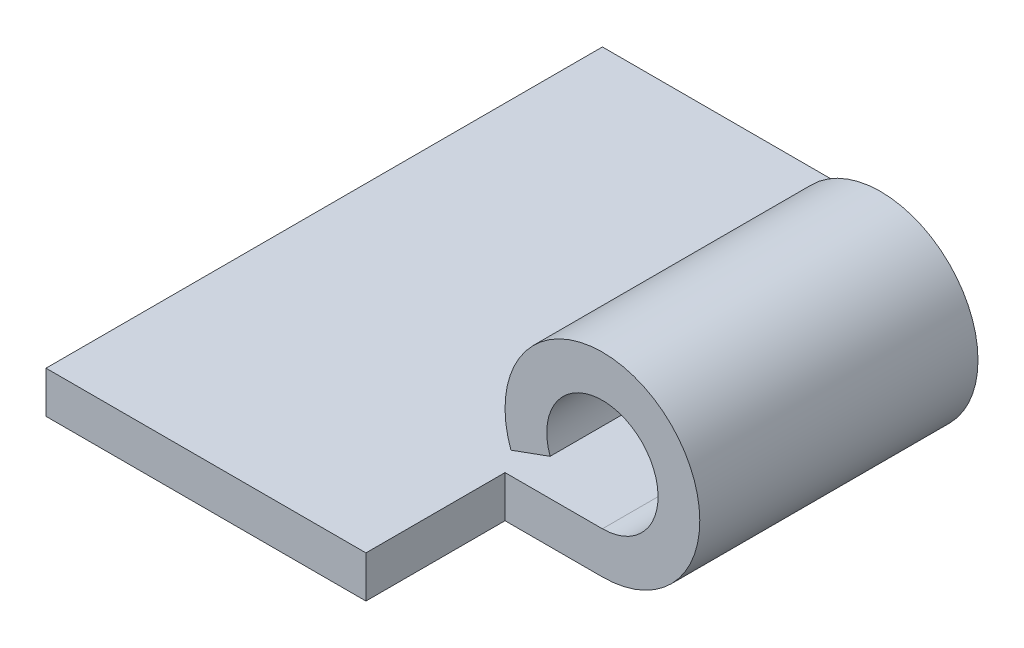
ISO-10303-21;
HEADER;
FILE_DESCRIPTION(('STEP AP214'),'2;1');
FILE_NAME('part.step','',(''),(''),'','','');
FILE_SCHEMA(('AUTOMOTIVE_DESIGN { 1 0 10303 214 1 1 1 1 }'));
ENDSEC;
DATA;
#1=APPLICATION_CONTEXT('core data for automotive mechanical design processes');
#2=APPLICATION_PROTOCOL_DEFINITION('international standard','automotive_design',2000,#1);
#3=PRODUCT_CONTEXT('',#1,'mechanical');
#4=PRODUCT('Part','Part','',(#3));
#5=PRODUCT_RELATED_PRODUCT_CATEGORY('part','',(#4));
#6=PRODUCT_DEFINITION_FORMATION('','',#4);
#7=PRODUCT_DEFINITION_CONTEXT('part definition',#1,'design');
#8=PRODUCT_DEFINITION('design','',#6,#7);
#9=PRODUCT_DEFINITION_SHAPE('','',#8);
#10=(LENGTH_UNIT() NAMED_UNIT(*) SI_UNIT(.MILLI.,.METRE.));
#11=(NAMED_UNIT(*) PLANE_ANGLE_UNIT() SI_UNIT($,.RADIAN.));
#12=(NAMED_UNIT(*) SI_UNIT($,.STERADIAN.) SOLID_ANGLE_UNIT());
#13=UNCERTAINTY_MEASURE_WITH_UNIT(LENGTH_MEASURE(1.E-05),#10,'distance_accuracy_value','');
#14=(GEOMETRIC_REPRESENTATION_CONTEXT(3) GLOBAL_UNCERTAINTY_ASSIGNED_CONTEXT((#13)) GLOBAL_UNIT_ASSIGNED_CONTEXT((#10,
#11,#12)) REPRESENTATION_CONTEXT('',''));
#15=CARTESIAN_POINT('',(0.,0.,0.));
#16=DIRECTION('',(0.,0.,1.));
#17=DIRECTION('',(1.,0.,0.));
#18=AXIS2_PLACEMENT_3D('',#15,#16,#17);
#19=CARTESIAN_POINT('',(18.5,-1.5,-5.));
#20=DIRECTION('',(0.,0.,1.));
#21=DIRECTION('',(1.,0.,0.));
#22=AXIS2_PLACEMENT_3D('',#19,#20,#21);
#23=PLANE('',#22);
#24=DIRECTION('',(1.,0.,0.));
#25=VECTOR('',#24,1.);
#26=CARTESIAN_POINT('',(0.,0.,-5.));
#27=LINE('',#26,#25);
#28=CARTESIAN_POINT('',(11.5,0.,-5.));
#29=VERTEX_POINT('',#28);
#30=CARTESIAN_POINT('',(15.,0.,-5.));
#31=VERTEX_POINT('',#30);
#32=EDGE_CURVE('E208',#29,#31,#27,.T.);
#33=ORIENTED_EDGE('',*,*,#32,.T.);
#34=DIRECTION('',(0.,-1.,0.));
#35=VECTOR('',#34,1.);
#36=CARTESIAN_POINT('',(15.,0.,-5.));
#37=LINE('',#36,#35);
#38=CARTESIAN_POINT('',(15.,-1.5,-5.));
#39=VERTEX_POINT('',#38);
#40=EDGE_CURVE('E12',#31,#39,#37,.T.);
#41=ORIENTED_EDGE('',*,*,#40,.T.);
#42=DIRECTION('',(1.,0.,0.));
#43=VECTOR('',#42,1.);
#44=CARTESIAN_POINT('',(18.5,-1.5,-5.));
#45=LINE('',#44,#43);
#46=CARTESIAN_POINT('',(11.5,-1.5,-5.));
#47=VERTEX_POINT('',#46);
#48=EDGE_CURVE('E163',#47,#39,#45,.T.);
#49=ORIENTED_EDGE('',*,*,#48,.F.);
#50=DIRECTION('',(0.,1.,0.));
#51=VECTOR('',#50,1.);
#52=CARTESIAN_POINT('',(11.5,-1.5,-5.));
#53=LINE('',#52,#51);
#54=EDGE_CURVE('E152',#47,#29,#53,.T.);
#55=ORIENTED_EDGE('',*,*,#54,.T.);
#56=EDGE_LOOP('',(#33,#41,#49,#55));
#57=FACE_BOUND('',#56,.T.);
#58=ADVANCED_FACE('F54',(#57),#23,.F.);
#59=CARTESIAN_POINT('',(15.,2.,10.));
#60=DIRECTION('',(0.,0.,-1.));
#61=DIRECTION('',(-1.,0.,0.));
#62=AXIS2_PLACEMENT_3D('',#59,#60,#61);
#63=CYLINDRICAL_SURFACE('',#62,3.5);
#64=DIRECTION('',(0.,0.,-1.));
#65=VECTOR('',#64,1.);
#66=CARTESIAN_POINT('',(15.,-1.5,10.));
#67=LINE('',#66,#65);
#68=CARTESIAN_POINT('',(15.,-1.5,5.));
#69=VERTEX_POINT('',#68);
#70=EDGE_CURVE('E232',#69,#39,#67,.T.);
#71=ORIENTED_EDGE('',*,*,#70,.T.);
#72=CARTESIAN_POINT('',(15.,2.,-5.));
#73=DIRECTION('',(0.,0.,1.));
#74=DIRECTION('',(1.,0.,0.));
#75=AXIS2_PLACEMENT_3D('',#72,#73,#74);
#76=CIRCLE('',#75,3.5);
#77=CARTESIAN_POINT('',(11.7110758272493,0.802929498360173,-5.));
#78=VERTEX_POINT('',#77);
#79=EDGE_CURVE('E216',#39,#78,#76,.T.);
#80=ORIENTED_EDGE('',*,*,#79,.T.);
#81=DIRECTION('',(0.,0.,-1.));
#82=VECTOR('',#81,1.);
#83=CARTESIAN_POINT('',(11.7110758272493,0.802929498360173,10.));
#84=LINE('',#83,#82);
#85=CARTESIAN_POINT('',(11.7110758272493,0.802929498360173,5.));
#86=VERTEX_POINT('',#85);
#87=EDGE_CURVE('E62',#86,#78,#84,.T.);
#88=ORIENTED_EDGE('',*,*,#87,.F.);
#89=CARTESIAN_POINT('',(15.,2.,5.));
#90=DIRECTION('',(0.,0.,-1.));
#91=DIRECTION('',(-1.,0.,0.));
#92=AXIS2_PLACEMENT_3D('',#89,#90,#91);
#93=CIRCLE('',#92,3.5);
#94=EDGE_CURVE('E204',#86,#69,#93,.T.);
#95=ORIENTED_EDGE('',*,*,#94,.T.);
#96=EDGE_LOOP('',(#71,#80,#88,#95));
#97=FACE_BOUND('',#96,.T.);
#98=ADVANCED_FACE('F56',(#97),#63,.T.);
#99=CARTESIAN_POINT('',(13.1206147584282,1.31595971334867,10.));
#100=DIRECTION('',(0.342020143325665,-0.93969262078591,0.));
#101=DIRECTION('',(0.93969262078591,0.342020143325665,0.));
#102=AXIS2_PLACEMENT_3D('',#99,#100,#101);
#103=PLANE('',#102);
#104=DIRECTION('',(-0.93969262078591,-0.342020143325665,0.));
#105=VECTOR('',#104,1.);
#106=CARTESIAN_POINT('',(13.1206147584282,1.31595971334867,-5.));
#107=LINE('',#106,#105);
#108=CARTESIAN_POINT('',(13.1206147584282,1.31595971334867,-5.));
#109=VERTEX_POINT('',#108);
#110=EDGE_CURVE('E214',#109,#78,#107,.T.);
#111=ORIENTED_EDGE('',*,*,#110,.F.);
#112=DIRECTION('',(0.,0.,-1.));
#113=VECTOR('',#112,1.);
#114=CARTESIAN_POINT('',(13.1206147584282,1.31595971334867,10.));
#115=LINE('',#114,#113);
#116=CARTESIAN_POINT('',(13.1206147584282,1.31595971334867,5.));
#117=VERTEX_POINT('',#116);
#118=EDGE_CURVE('E252',#117,#109,#115,.T.);
#119=ORIENTED_EDGE('',*,*,#118,.F.);
#120=DIRECTION('',(0.93969262078591,0.342020143325665,0.));
#121=VECTOR('',#120,1.);
#122=CARTESIAN_POINT('',(13.1206147584282,1.31595971334867,5.));
#123=LINE('',#122,#121);
#124=EDGE_CURVE('E202',#86,#117,#123,.T.);
#125=ORIENTED_EDGE('',*,*,#124,.F.);
#126=ORIENTED_EDGE('',*,*,#87,.T.);
#127=EDGE_LOOP('',(#111,#119,#125,#126));
#128=FACE_BOUND('',#127,.T.);
#129=ADVANCED_FACE('F262',(#128),#103,.T.);
#130=CARTESIAN_POINT('',(15.,2.,10.));
#131=DIRECTION('',(0.,0.,-1.));
#132=DIRECTION('',(-1.,0.,0.));
#133=AXIS2_PLACEMENT_3D('',#130,#131,#132);
#134=CYLINDRICAL_SURFACE('',#133,2.);
#135=CARTESIAN_POINT('',(15.,2.,-5.));
#136=DIRECTION('',(0.,0.,1.));
#137=DIRECTION('',(1.,0.,0.));
#138=AXIS2_PLACEMENT_3D('',#135,#136,#137);
#139=CIRCLE('',#138,2.);
#140=EDGE_CURVE('E211',#31,#109,#139,.T.);
#141=ORIENTED_EDGE('',*,*,#140,.F.);
#142=DIRECTION('',(0.,0.,-1.));
#143=VECTOR('',#142,1.);
#144=CARTESIAN_POINT('',(15.,0.,10.));
#145=LINE('',#144,#143);
#146=CARTESIAN_POINT('',(15.,0.,5.));
#147=VERTEX_POINT('',#146);
#148=EDGE_CURVE('E248',#147,#31,#145,.T.);
#149=ORIENTED_EDGE('',*,*,#148,.F.);
#150=CARTESIAN_POINT('',(15.,2.,5.));
#151=DIRECTION('',(0.,0.,-1.));
#152=DIRECTION('',(-1.,0.,0.));
#153=AXIS2_PLACEMENT_3D('',#150,#151,#152);
#154=CIRCLE('',#153,2.);
#155=EDGE_CURVE('E199',#117,#147,#154,.T.);
#156=ORIENTED_EDGE('',*,*,#155,.F.);
#157=ORIENTED_EDGE('',*,*,#118,.T.);
#158=EDGE_LOOP('',(#141,#149,#156,#157));
#159=FACE_BOUND('',#158,.T.);
#160=ADVANCED_FACE('F270',(#159),#134,.F.);
#161=CARTESIAN_POINT('',(0.,0.,10.));
#162=DIRECTION('',(0.,1.,0.));
#163=DIRECTION('',(0.,0.,1.));
#164=AXIS2_PLACEMENT_3D('',#161,#162,#163);
#165=PLANE('',#164);
#166=ORIENTED_EDGE('',*,*,#32,.F.);
#167=DIRECTION('',(0.,0.,1.));
#168=VECTOR('',#167,1.);
#169=CARTESIAN_POINT('',(11.5,0.,10.));
#170=LINE('',#169,#168);
#171=CARTESIAN_POINT('',(11.5,0.,-10.));
#172=VERTEX_POINT('',#171);
#173=EDGE_CURVE('E156',#172,#29,#170,.T.);
#174=ORIENTED_EDGE('',*,*,#173,.F.);
#175=DIRECTION('',(1.,0.,0.));
#176=VECTOR('',#175,1.);
#177=CARTESIAN_POINT('',(0.,0.,-10.));
#178=LINE('',#177,#176);
#179=CARTESIAN_POINT('',(0.,0.,-10.));
#180=VERTEX_POINT('',#179);
#181=EDGE_CURVE('E220',#180,#172,#178,.T.);
#182=ORIENTED_EDGE('',*,*,#181,.F.);
#183=DIRECTION('',(0.,0.,-1.));
#184=VECTOR('',#183,1.);
#185=CARTESIAN_POINT('',(0.,0.,10.));
#186=LINE('',#185,#184);
#187=CARTESIAN_POINT('',(0.,0.,10.));
#188=VERTEX_POINT('',#187);
#189=EDGE_CURVE('E245',#188,#180,#186,.T.);
#190=ORIENTED_EDGE('',*,*,#189,.F.);
#191=DIRECTION('',(1.,0.,0.));
#192=VECTOR('',#191,1.);
#193=CARTESIAN_POINT('',(0.,0.,10.));
#194=LINE('',#193,#192);
#195=CARTESIAN_POINT('',(11.5,0.,10.));
#196=VERTEX_POINT('',#195);
#197=EDGE_CURVE('E221',#188,#196,#194,.T.);
#198=ORIENTED_EDGE('',*,*,#197,.T.);
#199=DIRECTION('',(0.,0.,1.));
#200=VECTOR('',#199,1.);
#201=CARTESIAN_POINT('',(11.5,0.,10.));
#202=LINE('',#201,#200);
#203=CARTESIAN_POINT('',(11.5,0.,5.));
#204=VERTEX_POINT('',#203);
#205=EDGE_CURVE('E73',#204,#196,#202,.T.);
#206=ORIENTED_EDGE('',*,*,#205,.F.);
#207=DIRECTION('',(-1.,0.,0.));
#208=VECTOR('',#207,1.);
#209=CARTESIAN_POINT('',(0.,0.,5.));
#210=LINE('',#209,#208);
#211=EDGE_CURVE('E196',#147,#204,#210,.T.);
#212=ORIENTED_EDGE('',*,*,#211,.F.);
#213=ORIENTED_EDGE('',*,*,#148,.T.);
#214=EDGE_LOOP('',(#166,#174,#182,#190,#198,#206,#212,#213));
#215=FACE_BOUND('',#214,.T.);
#216=ADVANCED_FACE('F274',(#215),#165,.T.);
#217=CARTESIAN_POINT('',(0.,-1.5,10.));
#218=DIRECTION('',(-1.,0.,0.));
#219=DIRECTION('',(0.,0.,1.));
#220=AXIS2_PLACEMENT_3D('',#217,#218,#219);
#221=PLANE('',#220);
#222=DIRECTION('',(0.,1.,0.));
#223=VECTOR('',#222,1.);
#224=CARTESIAN_POINT('',(0.,-1.5,-10.));
#225=LINE('',#224,#223);
#226=CARTESIAN_POINT('',(0.,-1.5,-10.));
#227=VERTEX_POINT('',#226);
#228=EDGE_CURVE('E235',#227,#180,#225,.T.);
#229=ORIENTED_EDGE('',*,*,#228,.F.);
#230=DIRECTION('',(0.,0.,-1.));
#231=VECTOR('',#230,1.);
#232=CARTESIAN_POINT('',(0.,-1.5,10.));
#233=LINE('',#232,#231);
#234=CARTESIAN_POINT('',(0.,-1.5,10.));
#235=VERTEX_POINT('',#234);
#236=EDGE_CURVE('E242',#235,#227,#233,.T.);
#237=ORIENTED_EDGE('',*,*,#236,.F.);
#238=DIRECTION('',(0.,1.,0.));
#239=VECTOR('',#238,1.);
#240=CARTESIAN_POINT('',(0.,-1.5,10.));
#241=LINE('',#240,#239);
#242=EDGE_CURVE('E225',#235,#188,#241,.T.);
#243=ORIENTED_EDGE('',*,*,#242,.T.);
#244=ORIENTED_EDGE('',*,*,#189,.T.);
#245=EDGE_LOOP('',(#229,#237,#243,#244));
#246=FACE_BOUND('',#245,.T.);
#247=ADVANCED_FACE('F286',(#246),#221,.T.);
#248=CARTESIAN_POINT('',(0.,-1.5,10.));
#249=DIRECTION('',(0.,1.,0.));
#250=DIRECTION('',(0.,0.,1.));
#251=AXIS2_PLACEMENT_3D('',#248,#249,#250);
#252=PLANE('',#251);
#253=DIRECTION('',(0.,0.,1.));
#254=VECTOR('',#253,1.);
#255=CARTESIAN_POINT('',(11.5,-1.5,-10.));
#256=LINE('',#255,#254);
#257=CARTESIAN_POINT('',(11.5,-1.5,-10.));
#258=VERTEX_POINT('',#257);
#259=EDGE_CURVE('E83',#258,#47,#256,.T.);
#260=ORIENTED_EDGE('',*,*,#259,.T.);
#261=ORIENTED_EDGE('',*,*,#48,.T.);
#262=ORIENTED_EDGE('',*,*,#70,.F.);
#263=DIRECTION('',(-1.,0.,0.));
#264=VECTOR('',#263,1.);
#265=CARTESIAN_POINT('',(18.5,-1.5,5.));
#266=LINE('',#265,#264);
#267=CARTESIAN_POINT('',(11.5,-1.5,5.));
#268=VERTEX_POINT('',#267);
#269=EDGE_CURVE('E175',#69,#268,#266,.T.);
#270=ORIENTED_EDGE('',*,*,#269,.T.);
#271=DIRECTION('',(0.,0.,1.));
#272=VECTOR('',#271,1.);
#273=CARTESIAN_POINT('',(11.5,-1.5,10.));
#274=LINE('',#273,#272);
#275=CARTESIAN_POINT('',(11.5,-1.5,10.));
#276=VERTEX_POINT('',#275);
#277=EDGE_CURVE('E182',#268,#276,#274,.T.);
#278=ORIENTED_EDGE('',*,*,#277,.T.);
#279=DIRECTION('',(1.,0.,0.));
#280=VECTOR('',#279,1.);
#281=CARTESIAN_POINT('',(0.,-1.5,10.));
#282=LINE('',#281,#280);
#283=EDGE_CURVE('E228',#235,#276,#282,.T.);
#284=ORIENTED_EDGE('',*,*,#283,.F.);
#285=ORIENTED_EDGE('',*,*,#236,.T.);
#286=DIRECTION('',(1.,0.,0.));
#287=VECTOR('',#286,1.);
#288=CARTESIAN_POINT('',(0.,-1.5,-10.));
#289=LINE('',#288,#287);
#290=EDGE_CURVE('E173',#227,#258,#289,.T.);
#291=ORIENTED_EDGE('',*,*,#290,.T.);
#292=EDGE_LOOP('',(#260,#261,#262,#270,#278,#284,#285,#291));
#293=FACE_BOUND('',#292,.T.);
#294=ADVANCED_FACE('F171',(#293),#252,.F.);
#295=CARTESIAN_POINT('',(15.,2.,10.));
#296=DIRECTION('',(0.,0.,1.));
#297=DIRECTION('',(1.,0.,0.));
#298=AXIS2_PLACEMENT_3D('',#295,#296,#297);
#299=PLANE('',#298);
#300=DIRECTION('',(0.,1.,0.));
#301=VECTOR('',#300,1.);
#302=CARTESIAN_POINT('',(11.5,-1.5,10.));
#303=LINE('',#302,#301);
#304=EDGE_CURVE('E188',#276,#196,#303,.T.);
#305=ORIENTED_EDGE('',*,*,#304,.T.);
#306=ORIENTED_EDGE('',*,*,#197,.F.);
#307=ORIENTED_EDGE('',*,*,#242,.F.);
#308=ORIENTED_EDGE('',*,*,#283,.T.);
#309=EDGE_LOOP('',(#305,#306,#307,#308));
#310=FACE_BOUND('',#309,.T.);
#311=ADVANCED_FACE('F282',(#310),#299,.T.);
#312=CARTESIAN_POINT('',(15.,2.,-10.));
#313=DIRECTION('',(0.,0.,1.));
#314=DIRECTION('',(1.,0.,0.));
#315=AXIS2_PLACEMENT_3D('',#312,#313,#314);
#316=PLANE('',#315);
#317=ORIENTED_EDGE('',*,*,#181,.T.);
#318=DIRECTION('',(0.,1.,0.));
#319=VECTOR('',#318,1.);
#320=CARTESIAN_POINT('',(11.5,-1.5,-10.));
#321=LINE('',#320,#319);
#322=EDGE_CURVE('E160',#258,#172,#321,.T.);
#323=ORIENTED_EDGE('',*,*,#322,.F.);
#324=ORIENTED_EDGE('',*,*,#290,.F.);
#325=ORIENTED_EDGE('',*,*,#228,.T.);
#326=EDGE_LOOP('',(#317,#323,#324,#325));
#327=FACE_BOUND('',#326,.T.);
#328=ADVANCED_FACE('F289',(#327),#316,.F.);
#329=ORIENTED_EDGE('',*,*,#40,.F.);
#330=ORIENTED_EDGE('',*,*,#140,.T.);
#331=ORIENTED_EDGE('',*,*,#110,.T.);
#332=ORIENTED_EDGE('',*,*,#79,.F.);
#333=EDGE_LOOP('',(#329,#330,#331,#332));
#334=FACE_BOUND('',#333,.T.);
#335=ADVANCED_FACE('F266',(#334),#23,.F.);
#336=CARTESIAN_POINT('',(11.5,-1.5,-10.));
#337=DIRECTION('',(-1.,0.,0.));
#338=DIRECTION('',(0.,0.,1.));
#339=AXIS2_PLACEMENT_3D('',#336,#337,#338);
#340=PLANE('',#339);
#341=ORIENTED_EDGE('',*,*,#173,.T.);
#342=ORIENTED_EDGE('',*,*,#54,.F.);
#343=ORIENTED_EDGE('',*,*,#259,.F.);
#344=ORIENTED_EDGE('',*,*,#322,.T.);
#345=EDGE_LOOP('',(#341,#342,#343,#344));
#346=FACE_BOUND('',#345,.T.);
#347=ADVANCED_FACE('F154',(#346),#340,.F.);
#348=CARTESIAN_POINT('',(18.5,-1.5,5.));
#349=DIRECTION('',(0.,0.,-1.));
#350=DIRECTION('',(-1.,0.,0.));
#351=AXIS2_PLACEMENT_3D('',#348,#349,#350);
#352=PLANE('',#351);
#353=ORIENTED_EDGE('',*,*,#94,.F.);
#354=ORIENTED_EDGE('',*,*,#124,.T.);
#355=ORIENTED_EDGE('',*,*,#155,.T.);
#356=ORIENTED_EDGE('',*,*,#211,.T.);
#357=DIRECTION('',(0.,1.,0.));
#358=VECTOR('',#357,1.);
#359=CARTESIAN_POINT('',(11.5,-1.5,5.));
#360=LINE('',#359,#358);
#361=EDGE_CURVE('E186',#268,#204,#360,.T.);
#362=ORIENTED_EDGE('',*,*,#361,.F.);
#363=ORIENTED_EDGE('',*,*,#269,.F.);
#364=EDGE_LOOP('',(#353,#354,#355,#356,#362,#363));
#365=FACE_BOUND('',#364,.T.);
#366=ADVANCED_FACE('F276',(#365),#352,.F.);
#367=CARTESIAN_POINT('',(11.5,-1.5,10.));
#368=DIRECTION('',(-1.,0.,0.));
#369=DIRECTION('',(0.,0.,1.));
#370=AXIS2_PLACEMENT_3D('',#367,#368,#369);
#371=PLANE('',#370);
#372=ORIENTED_EDGE('',*,*,#205,.T.);
#373=ORIENTED_EDGE('',*,*,#304,.F.);
#374=ORIENTED_EDGE('',*,*,#277,.F.);
#375=ORIENTED_EDGE('',*,*,#361,.T.);
#376=EDGE_LOOP('',(#372,#373,#374,#375));
#377=FACE_BOUND('',#376,.T.);
#378=ADVANCED_FACE('F278',(#377),#371,.F.);
#379=CLOSED_SHELL('',(#58,#98,#129,#160,#216,#247,#294,#311,#328,#335,#347,#366,#378));
#380=MANIFOLD_SOLID_BREP('B2',#379);
#381=ADVANCED_BREP_SHAPE_REPRESENTATION('',(#18,#380),#14);
#382=SHAPE_DEFINITION_REPRESENTATION(#9,#381);
ENDSEC;
END-ISO-10303-21;
